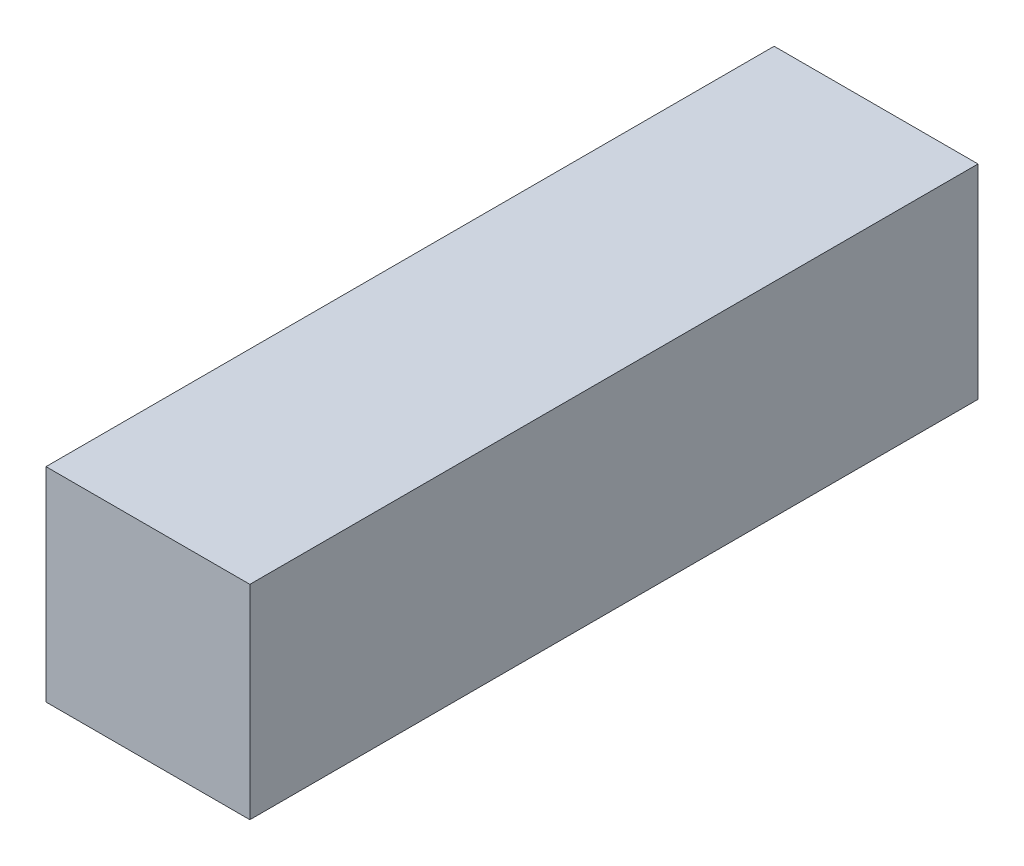
ISO-10303-21;
HEADER;
FILE_DESCRIPTION(('STEP AP214'),'2;1');
FILE_NAME('part.step','',(''),(''),'','','');
FILE_SCHEMA(('AUTOMOTIVE_DESIGN { 1 0 10303 214 1 1 1 1 }'));
ENDSEC;
DATA;
#1=APPLICATION_CONTEXT('core data for automotive mechanical design processes');
#2=APPLICATION_PROTOCOL_DEFINITION('international standard','automotive_design',2000,#1);
#3=PRODUCT_CONTEXT('',#1,'mechanical');
#4=PRODUCT('Part','Part','',(#3));
#5=PRODUCT_RELATED_PRODUCT_CATEGORY('part','',(#4));
#6=PRODUCT_DEFINITION_FORMATION('','',#4);
#7=PRODUCT_DEFINITION_CONTEXT('part definition',#1,'design');
#8=PRODUCT_DEFINITION('design','',#6,#7);
#9=PRODUCT_DEFINITION_SHAPE('','',#8);
#10=(LENGTH_UNIT() NAMED_UNIT(*) SI_UNIT(.MILLI.,.METRE.));
#11=(NAMED_UNIT(*) PLANE_ANGLE_UNIT() SI_UNIT($,.RADIAN.));
#12=(NAMED_UNIT(*) SI_UNIT($,.STERADIAN.) SOLID_ANGLE_UNIT());
#13=UNCERTAINTY_MEASURE_WITH_UNIT(LENGTH_MEASURE(1.E-05),#10,'distance_accuracy_value','');
#14=(GEOMETRIC_REPRESENTATION_CONTEXT(3) GLOBAL_UNCERTAINTY_ASSIGNED_CONTEXT((#13)) GLOBAL_UNIT_ASSIGNED_CONTEXT((#10,
#11,#12)) REPRESENTATION_CONTEXT('',''));
#15=CARTESIAN_POINT('',(0.,0.,0.));
#16=DIRECTION('',(0.,0.,1.));
#17=DIRECTION('',(1.,0.,0.));
#18=AXIS2_PLACEMENT_3D('',#15,#16,#17);
#19=CARTESIAN_POINT('',(35.,-35.,-250.));
#20=DIRECTION('',(1.,0.,0.));
#21=DIRECTION('',(0.,0.,-1.));
#22=AXIS2_PLACEMENT_3D('',#19,#20,#21);
#23=PLANE('',#22);
#24=DIRECTION('',(0.,1.,0.));
#25=VECTOR('',#24,1.);
#26=CARTESIAN_POINT('',(35.,-35.,0.));
#27=LINE('',#26,#25);
#28=CARTESIAN_POINT('',(35.,-35.,0.));
#29=VERTEX_POINT('',#28);
#30=CARTESIAN_POINT('',(35.,35.,0.));
#31=VERTEX_POINT('',#30);
#32=EDGE_CURVE('E100',#29,#31,#27,.T.);
#33=ORIENTED_EDGE('',*,*,#32,.F.);
#34=DIRECTION('',(0.,0.,1.));
#35=VECTOR('',#34,1.);
#36=CARTESIAN_POINT('',(35.,-35.,-250.));
#37=LINE('',#36,#35);
#38=CARTESIAN_POINT('',(35.,-35.,-250.));
#39=VERTEX_POINT('',#38);
#40=EDGE_CURVE('E11',#39,#29,#37,.T.);
#41=ORIENTED_EDGE('',*,*,#40,.F.);
#42=DIRECTION('',(0.,1.,0.));
#43=VECTOR('',#42,1.);
#44=CARTESIAN_POINT('',(35.,-35.,-250.));
#45=LINE('',#44,#43);
#46=CARTESIAN_POINT('',(35.,35.,-250.));
#47=VERTEX_POINT('',#46);
#48=EDGE_CURVE('E94',#39,#47,#45,.T.);
#49=ORIENTED_EDGE('',*,*,#48,.T.);
#50=DIRECTION('',(0.,0.,1.));
#51=VECTOR('',#50,1.);
#52=CARTESIAN_POINT('',(35.,35.,-250.));
#53=LINE('',#52,#51);
#54=EDGE_CURVE('E39',#47,#31,#53,.T.);
#55=ORIENTED_EDGE('',*,*,#54,.T.);
#56=EDGE_LOOP('',(#33,#41,#49,#55));
#57=FACE_BOUND('',#56,.T.);
#58=ADVANCED_FACE('F36',(#57),#23,.T.);
#59=CARTESIAN_POINT('',(-35.,-35.,-250.));
#60=DIRECTION('',(0.,-1.,0.));
#61=DIRECTION('',(0.,0.,-1.));
#62=AXIS2_PLACEMENT_3D('',#59,#60,#61);
#63=PLANE('',#62);
#64=DIRECTION('',(1.,0.,0.));
#65=VECTOR('',#64,1.);
#66=CARTESIAN_POINT('',(-35.,-35.,0.));
#67=LINE('',#66,#65);
#68=CARTESIAN_POINT('',(-35.,-35.,0.));
#69=VERTEX_POINT('',#68);
#70=EDGE_CURVE('E96',#69,#29,#67,.T.);
#71=ORIENTED_EDGE('',*,*,#70,.F.);
#72=DIRECTION('',(0.,0.,1.));
#73=VECTOR('',#72,1.);
#74=CARTESIAN_POINT('',(-35.,-35.,-250.));
#75=LINE('',#74,#73);
#76=CARTESIAN_POINT('',(-35.,-35.,-250.));
#77=VERTEX_POINT('',#76);
#78=EDGE_CURVE('E45',#77,#69,#75,.T.);
#79=ORIENTED_EDGE('',*,*,#78,.F.);
#80=DIRECTION('',(1.,0.,0.));
#81=VECTOR('',#80,1.);
#82=CARTESIAN_POINT('',(-35.,-35.,-250.));
#83=LINE('',#82,#81);
#84=EDGE_CURVE('E91',#77,#39,#83,.T.);
#85=ORIENTED_EDGE('',*,*,#84,.T.);
#86=ORIENTED_EDGE('',*,*,#40,.T.);
#87=EDGE_LOOP('',(#71,#79,#85,#86));
#88=FACE_BOUND('',#87,.T.);
#89=ADVANCED_FACE('F110',(#88),#63,.T.);
#90=CARTESIAN_POINT('',(-35.,-35.,-250.));
#91=DIRECTION('',(-1.,0.,0.));
#92=DIRECTION('',(0.,0.,1.));
#93=AXIS2_PLACEMENT_3D('',#90,#91,#92);
#94=PLANE('',#93);
#95=DIRECTION('',(0.,-1.,0.));
#96=VECTOR('',#95,1.);
#97=CARTESIAN_POINT('',(-35.,-35.,0.));
#98=LINE('',#97,#96);
#99=CARTESIAN_POINT('',(-35.,35.,0.));
#100=VERTEX_POINT('',#99);
#101=EDGE_CURVE('E86',#100,#69,#98,.T.);
#102=ORIENTED_EDGE('',*,*,#101,.F.);
#103=DIRECTION('',(0.,0.,1.));
#104=VECTOR('',#103,1.);
#105=CARTESIAN_POINT('',(-35.,35.,-250.));
#106=LINE('',#105,#104);
#107=CARTESIAN_POINT('',(-35.,35.,-250.));
#108=VERTEX_POINT('',#107);
#109=EDGE_CURVE('E81',#108,#100,#106,.T.);
#110=ORIENTED_EDGE('',*,*,#109,.F.);
#111=DIRECTION('',(0.,-1.,0.));
#112=VECTOR('',#111,1.);
#113=CARTESIAN_POINT('',(-35.,-35.,-250.));
#114=LINE('',#113,#112);
#115=EDGE_CURVE('E84',#108,#77,#114,.T.);
#116=ORIENTED_EDGE('',*,*,#115,.T.);
#117=ORIENTED_EDGE('',*,*,#78,.T.);
#118=EDGE_LOOP('',(#102,#110,#116,#117));
#119=FACE_BOUND('',#118,.T.);
#120=ADVANCED_FACE('F83',(#119),#94,.T.);
#121=CARTESIAN_POINT('',(-35.,35.,-250.));
#122=DIRECTION('',(0.,1.,0.));
#123=DIRECTION('',(0.,0.,1.));
#124=AXIS2_PLACEMENT_3D('',#121,#122,#123);
#125=PLANE('',#124);
#126=DIRECTION('',(-1.,0.,0.));
#127=VECTOR('',#126,1.);
#128=CARTESIAN_POINT('',(-35.,35.,0.));
#129=LINE('',#128,#127);
#130=EDGE_CURVE('E103',#31,#100,#129,.T.);
#131=ORIENTED_EDGE('',*,*,#130,.F.);
#132=ORIENTED_EDGE('',*,*,#54,.F.);
#133=DIRECTION('',(-1.,0.,0.));
#134=VECTOR('',#133,1.);
#135=CARTESIAN_POINT('',(-35.,35.,-250.));
#136=LINE('',#135,#134);
#137=EDGE_CURVE('E90',#47,#108,#136,.T.);
#138=ORIENTED_EDGE('',*,*,#137,.T.);
#139=ORIENTED_EDGE('',*,*,#109,.T.);
#140=EDGE_LOOP('',(#131,#132,#138,#139));
#141=FACE_BOUND('',#140,.T.);
#142=ADVANCED_FACE('F93',(#141),#125,.T.);
#143=CARTESIAN_POINT('',(0.,0.,-250.));
#144=DIRECTION('',(0.,0.,-1.));
#145=DIRECTION('',(-1.,0.,0.));
#146=AXIS2_PLACEMENT_3D('',#143,#144,#145);
#147=PLANE('',#146);
#148=ORIENTED_EDGE('',*,*,#48,.F.);
#149=ORIENTED_EDGE('',*,*,#84,.F.);
#150=ORIENTED_EDGE('',*,*,#115,.F.);
#151=ORIENTED_EDGE('',*,*,#137,.F.);
#152=EDGE_LOOP('',(#148,#149,#150,#151));
#153=FACE_BOUND('',#152,.T.);
#154=ADVANCED_FACE('F89',(#153),#147,.T.);
#155=CARTESIAN_POINT('',(0.,0.,0.));
#156=DIRECTION('',(0.,0.,-1.));
#157=DIRECTION('',(-1.,0.,0.));
#158=AXIS2_PLACEMENT_3D('',#155,#156,#157);
#159=PLANE('',#158);
#160=ORIENTED_EDGE('',*,*,#32,.T.);
#161=ORIENTED_EDGE('',*,*,#130,.T.);
#162=ORIENTED_EDGE('',*,*,#101,.T.);
#163=ORIENTED_EDGE('',*,*,#70,.T.);
#164=EDGE_LOOP('',(#160,#161,#162,#163));
#165=FACE_BOUND('',#164,.T.);
#166=ADVANCED_FACE('F109',(#165),#159,.F.);
#167=CLOSED_SHELL('',(#58,#89,#120,#142,#154,#166));
#168=MANIFOLD_SOLID_BREP('B2',#167);
#169=ADVANCED_BREP_SHAPE_REPRESENTATION('',(#18,#168),#14);
#170=SHAPE_DEFINITION_REPRESENTATION(#9,#169);
ENDSEC;
END-ISO-10303-21;
